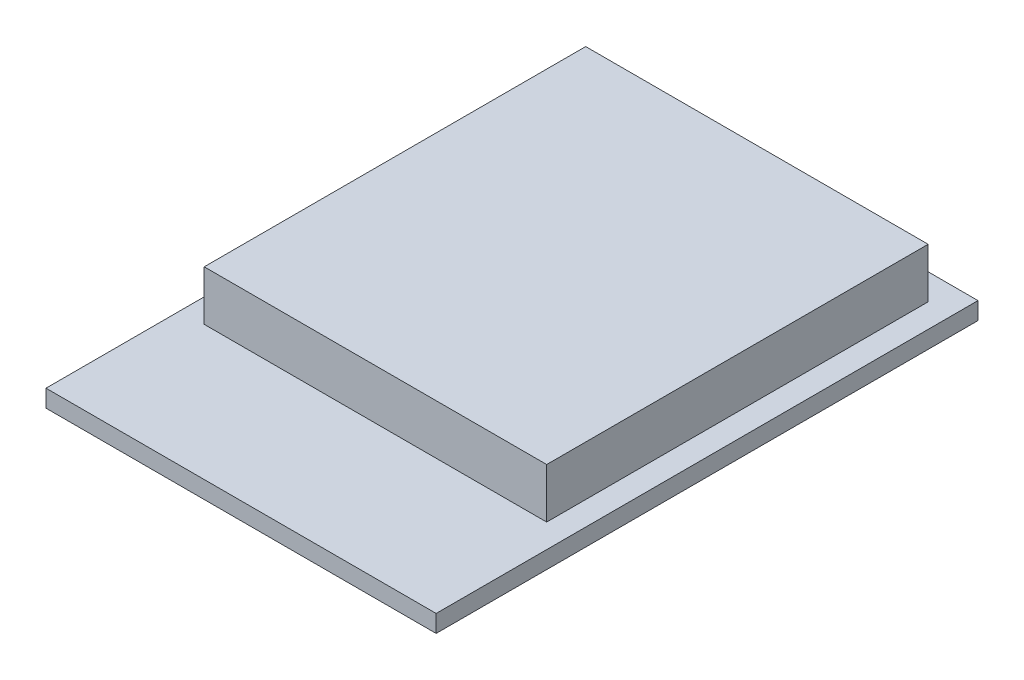
ISO-10303-21;
HEADER;
FILE_DESCRIPTION(('STEP AP214'),'2;1');
FILE_NAME('part.step','',(''),(''),'','','');
FILE_SCHEMA(('AUTOMOTIVE_DESIGN { 1 0 10303 214 1 1 1 1 }'));
ENDSEC;
DATA;
#1=APPLICATION_CONTEXT('core data for automotive mechanical design processes');
#2=APPLICATION_PROTOCOL_DEFINITION('international standard','automotive_design',2000,#1);
#3=PRODUCT_CONTEXT('',#1,'mechanical');
#4=PRODUCT('Part','Part','',(#3));
#5=PRODUCT_RELATED_PRODUCT_CATEGORY('part','',(#4));
#6=PRODUCT_DEFINITION_FORMATION('','',#4);
#7=PRODUCT_DEFINITION_CONTEXT('part definition',#1,'design');
#8=PRODUCT_DEFINITION('design','',#6,#7);
#9=PRODUCT_DEFINITION_SHAPE('','',#8);
#10=(LENGTH_UNIT() NAMED_UNIT(*) SI_UNIT(.MILLI.,.METRE.));
#11=(NAMED_UNIT(*) PLANE_ANGLE_UNIT() SI_UNIT($,.RADIAN.));
#12=(NAMED_UNIT(*) SI_UNIT($,.STERADIAN.) SOLID_ANGLE_UNIT());
#13=UNCERTAINTY_MEASURE_WITH_UNIT(LENGTH_MEASURE(1.E-05),#10,'distance_accuracy_value','');
#14=(GEOMETRIC_REPRESENTATION_CONTEXT(3) GLOBAL_UNCERTAINTY_ASSIGNED_CONTEXT((#13)) GLOBAL_UNIT_ASSIGNED_CONTEXT((#10,
#11,#12)) REPRESENTATION_CONTEXT('',''));
#15=CARTESIAN_POINT('',(0.,0.,0.));
#16=DIRECTION('',(0.,0.,1.));
#17=DIRECTION('',(1.,0.,0.));
#18=AXIS2_PLACEMENT_3D('',#15,#16,#17);
#19=CARTESIAN_POINT('',(-9.,0.8,12.5));
#20=DIRECTION('',(0.,1.,0.));
#21=DIRECTION('',(0.,0.,1.));
#22=AXIS2_PLACEMENT_3D('',#19,#20,#21);
#23=PLANE('',#22);
#24=DIRECTION('',(0.,0.,1.));
#25=VECTOR('',#24,1.);
#26=CARTESIAN_POINT('',(-9.,0.8,-12.5));
#27=LINE('',#26,#25);
#28=CARTESIAN_POINT('',(-9.,0.8,-12.5));
#29=VERTEX_POINT('',#28);
#30=CARTESIAN_POINT('',(-9.,0.8,12.5));
#31=VERTEX_POINT('',#30);
#32=EDGE_CURVE('E481',#29,#31,#27,.T.);
#33=ORIENTED_EDGE('',*,*,#32,.T.);
#34=DIRECTION('',(1.,0.,0.));
#35=VECTOR('',#34,1.);
#36=CARTESIAN_POINT('',(-9.,0.8,12.5));
#37=LINE('',#36,#35);
#38=CARTESIAN_POINT('',(9.,0.8,12.5));
#39=VERTEX_POINT('',#38);
#40=EDGE_CURVE('E483',#31,#39,#37,.T.);
#41=ORIENTED_EDGE('',*,*,#40,.T.);
#42=DIRECTION('',(0.,0.,-1.));
#43=VECTOR('',#42,1.);
#44=CARTESIAN_POINT('',(9.,0.8,-12.5));
#45=LINE('',#44,#43);
#46=CARTESIAN_POINT('',(9.,0.8,-12.5));
#47=VERTEX_POINT('',#46);
#48=EDGE_CURVE('E485',#39,#47,#45,.T.);
#49=ORIENTED_EDGE('',*,*,#48,.T.);
#50=DIRECTION('',(-1.,0.,0.));
#51=VECTOR('',#50,1.);
#52=CARTESIAN_POINT('',(-9.,0.8,-12.5));
#53=LINE('',#52,#51);
#54=EDGE_CURVE('E390',#47,#29,#53,.T.);
#55=ORIENTED_EDGE('',*,*,#54,.T.);
#56=EDGE_LOOP('',(#33,#41,#49,#55));
#57=FACE_BOUND('',#56,.T.);
#58=DIRECTION('',(-1.,0.,0.));
#59=VECTOR('',#58,1.);
#60=CARTESIAN_POINT('',(7.9,0.8,-11.3));
#61=LINE('',#60,#59);
#62=CARTESIAN_POINT('',(7.9,0.8,-11.3));
#63=VERTEX_POINT('',#62);
#64=CARTESIAN_POINT('',(-7.9,0.8,-11.3));
#65=VERTEX_POINT('',#64);
#66=EDGE_CURVE('E438',#63,#65,#61,.T.);
#67=ORIENTED_EDGE('',*,*,#66,.F.);
#68=DIRECTION('',(0.,0.,-1.));
#69=VECTOR('',#68,1.);
#70=CARTESIAN_POINT('',(7.9,0.8,6.3));
#71=LINE('',#70,#69);
#72=CARTESIAN_POINT('',(7.9,0.8,6.3));
#73=VERTEX_POINT('',#72);
#74=EDGE_CURVE('E449',#73,#63,#71,.T.);
#75=ORIENTED_EDGE('',*,*,#74,.F.);
#76=DIRECTION('',(1.,0.,0.));
#77=VECTOR('',#76,1.);
#78=CARTESIAN_POINT('',(7.9,0.8,6.3));
#79=LINE('',#78,#77);
#80=CARTESIAN_POINT('',(-7.9,0.8,6.3));
#81=VERTEX_POINT('',#80);
#82=EDGE_CURVE('E459',#81,#73,#79,.T.);
#83=ORIENTED_EDGE('',*,*,#82,.F.);
#84=DIRECTION('',(0.,0.,1.));
#85=VECTOR('',#84,1.);
#86=CARTESIAN_POINT('',(-7.9,0.8,6.3));
#87=LINE('',#86,#85);
#88=EDGE_CURVE('E457',#65,#81,#87,.T.);
#89=ORIENTED_EDGE('',*,*,#88,.F.);
#90=EDGE_LOOP('',(#67,#75,#83,#89));
#91=FACE_BOUND('',#90,.T.);
#92=ADVANCED_FACE('F367',(#57,#91),#23,.T.);
#93=CARTESIAN_POINT('',(-9.,0.8,-12.5));
#94=DIRECTION('',(1.,0.,0.));
#95=DIRECTION('',(0.,0.,-1.));
#96=AXIS2_PLACEMENT_3D('',#93,#94,#95);
#97=PLANE('',#96);
#98=DIRECTION('',(0.,0.,1.));
#99=VECTOR('',#98,1.);
#100=CARTESIAN_POINT('',(-9.,0.,-12.5));
#101=LINE('',#100,#99);
#102=CARTESIAN_POINT('',(-9.,0.,-12.5));
#103=VERTEX_POINT('',#102);
#104=CARTESIAN_POINT('',(-9.,0.,12.5));
#105=VERTEX_POINT('',#104);
#106=EDGE_CURVE('E444',#103,#105,#101,.T.);
#107=ORIENTED_EDGE('',*,*,#106,.T.);
#108=DIRECTION('',(0.,-1.,0.));
#109=VECTOR('',#108,1.);
#110=CARTESIAN_POINT('',(-9.,0.8,12.5));
#111=LINE('',#110,#109);
#112=EDGE_CURVE('E11',#31,#105,#111,.T.);
#113=ORIENTED_EDGE('',*,*,#112,.F.);
#114=ORIENTED_EDGE('',*,*,#32,.F.);
#115=DIRECTION('',(0.,-1.,0.));
#116=VECTOR('',#115,1.);
#117=CARTESIAN_POINT('',(-9.,0.8,-12.5));
#118=LINE('',#117,#116);
#119=EDGE_CURVE('E488',#29,#103,#118,.T.);
#120=ORIENTED_EDGE('',*,*,#119,.T.);
#121=EDGE_LOOP('',(#107,#113,#114,#120));
#122=FACE_BOUND('',#121,.T.);
#123=ADVANCED_FACE('F369',(#122),#97,.F.);
#124=CARTESIAN_POINT('',(-9.,0.8,12.5));
#125=DIRECTION('',(0.,0.,-1.));
#126=DIRECTION('',(-1.,0.,0.));
#127=AXIS2_PLACEMENT_3D('',#124,#125,#126);
#128=PLANE('',#127);
#129=DIRECTION('',(1.,0.,0.));
#130=VECTOR('',#129,1.);
#131=CARTESIAN_POINT('',(-9.,0.,12.5));
#132=LINE('',#131,#130);
#133=CARTESIAN_POINT('',(9.,0.,12.5));
#134=VERTEX_POINT('',#133);
#135=EDGE_CURVE('E475',#105,#134,#132,.T.);
#136=ORIENTED_EDGE('',*,*,#135,.T.);
#137=DIRECTION('',(0.,-1.,0.));
#138=VECTOR('',#137,1.);
#139=CARTESIAN_POINT('',(9.,0.8,12.5));
#140=LINE('',#139,#138);
#141=EDGE_CURVE('E375',#39,#134,#140,.T.);
#142=ORIENTED_EDGE('',*,*,#141,.F.);
#143=ORIENTED_EDGE('',*,*,#40,.F.);
#144=ORIENTED_EDGE('',*,*,#112,.T.);
#145=EDGE_LOOP('',(#136,#142,#143,#144));
#146=FACE_BOUND('',#145,.T.);
#147=ADVANCED_FACE('F510',(#146),#128,.F.);
#148=CARTESIAN_POINT('',(9.,0.8,-12.5));
#149=DIRECTION('',(-1.,0.,0.));
#150=DIRECTION('',(0.,0.,1.));
#151=AXIS2_PLACEMENT_3D('',#148,#149,#150);
#152=PLANE('',#151);
#153=DIRECTION('',(0.,0.,-1.));
#154=VECTOR('',#153,1.);
#155=CARTESIAN_POINT('',(9.,0.,-12.5));
#156=LINE('',#155,#154);
#157=CARTESIAN_POINT('',(9.,0.,-12.5));
#158=VERTEX_POINT('',#157);
#159=EDGE_CURVE('E477',#134,#158,#156,.T.);
#160=ORIENTED_EDGE('',*,*,#159,.T.);
#161=DIRECTION('',(0.,-1.,0.));
#162=VECTOR('',#161,1.);
#163=CARTESIAN_POINT('',(9.,0.8,-12.5));
#164=LINE('',#163,#162);
#165=EDGE_CURVE('E491',#47,#158,#164,.T.);
#166=ORIENTED_EDGE('',*,*,#165,.F.);
#167=ORIENTED_EDGE('',*,*,#48,.F.);
#168=ORIENTED_EDGE('',*,*,#141,.T.);
#169=EDGE_LOOP('',(#160,#166,#167,#168));
#170=FACE_BOUND('',#169,.T.);
#171=ADVANCED_FACE('F498',(#170),#152,.F.);
#172=CARTESIAN_POINT('',(-9.,0.8,-12.5));
#173=DIRECTION('',(0.,0.,1.));
#174=DIRECTION('',(1.,0.,0.));
#175=AXIS2_PLACEMENT_3D('',#172,#173,#174);
#176=PLANE('',#175);
#177=DIRECTION('',(-1.,0.,0.));
#178=VECTOR('',#177,1.);
#179=CARTESIAN_POINT('',(-9.,0.,-12.5));
#180=LINE('',#179,#178);
#181=EDGE_CURVE('E479',#158,#103,#180,.T.);
#182=ORIENTED_EDGE('',*,*,#181,.T.);
#183=ORIENTED_EDGE('',*,*,#119,.F.);
#184=ORIENTED_EDGE('',*,*,#54,.F.);
#185=ORIENTED_EDGE('',*,*,#165,.T.);
#186=EDGE_LOOP('',(#182,#183,#184,#185));
#187=FACE_BOUND('',#186,.T.);
#188=ADVANCED_FACE('F506',(#187),#176,.F.);
#189=CARTESIAN_POINT('',(-9.,0.,12.5));
#190=DIRECTION('',(0.,1.,0.));
#191=DIRECTION('',(0.,0.,1.));
#192=AXIS2_PLACEMENT_3D('',#189,#190,#191);
#193=PLANE('',#192);
#194=ORIENTED_EDGE('',*,*,#106,.F.);
#195=ORIENTED_EDGE('',*,*,#181,.F.);
#196=ORIENTED_EDGE('',*,*,#159,.F.);
#197=ORIENTED_EDGE('',*,*,#135,.F.);
#198=EDGE_LOOP('',(#194,#195,#196,#197));
#199=FACE_BOUND('',#198,.T.);
#200=ADVANCED_FACE('F504',(#199),#193,.F.);
#201=CARTESIAN_POINT('',(7.9,3.1,6.3));
#202=DIRECTION('',(-1.,0.,0.));
#203=DIRECTION('',(0.,0.,1.));
#204=AXIS2_PLACEMENT_3D('',#201,#202,#203);
#205=PLANE('',#204);
#206=ORIENTED_EDGE('',*,*,#74,.T.);
#207=DIRECTION('',(0.,-1.,0.));
#208=VECTOR('',#207,1.);
#209=CARTESIAN_POINT('',(7.9,3.1,-11.3));
#210=LINE('',#209,#208);
#211=CARTESIAN_POINT('',(7.9,3.1,-11.3));
#212=VERTEX_POINT('',#211);
#213=EDGE_CURVE('E433',#212,#63,#210,.T.);
#214=ORIENTED_EDGE('',*,*,#213,.F.);
#215=DIRECTION('',(0.,0.,-1.));
#216=VECTOR('',#215,1.);
#217=CARTESIAN_POINT('',(7.9,3.1,6.3));
#218=LINE('',#217,#216);
#219=CARTESIAN_POINT('',(7.9,3.1,6.3));
#220=VERTEX_POINT('',#219);
#221=EDGE_CURVE('E463',#220,#212,#218,.T.);
#222=ORIENTED_EDGE('',*,*,#221,.F.);
#223=DIRECTION('',(0.,-1.,0.));
#224=VECTOR('',#223,1.);
#225=CARTESIAN_POINT('',(7.9,3.1,6.3));
#226=LINE('',#225,#224);
#227=EDGE_CURVE('E452',#220,#73,#226,.T.);
#228=ORIENTED_EDGE('',*,*,#227,.T.);
#229=EDGE_LOOP('',(#206,#214,#222,#228));
#230=FACE_BOUND('',#229,.T.);
#231=ADVANCED_FACE('F450',(#230),#205,.F.);
#232=CARTESIAN_POINT('',(7.9,3.1,-11.3));
#233=DIRECTION('',(0.,0.,1.));
#234=DIRECTION('',(1.,0.,0.));
#235=AXIS2_PLACEMENT_3D('',#232,#233,#234);
#236=PLANE('',#235);
#237=ORIENTED_EDGE('',*,*,#66,.T.);
#238=DIRECTION('',(0.,-1.,0.));
#239=VECTOR('',#238,1.);
#240=CARTESIAN_POINT('',(-7.9,3.1,-11.3));
#241=LINE('',#240,#239);
#242=CARTESIAN_POINT('',(-7.9,3.1,-11.3));
#243=VERTEX_POINT('',#242);
#244=EDGE_CURVE('E445',#243,#65,#241,.T.);
#245=ORIENTED_EDGE('',*,*,#244,.F.);
#246=DIRECTION('',(-1.,0.,0.));
#247=VECTOR('',#246,1.);
#248=CARTESIAN_POINT('',(7.9,3.1,-11.3));
#249=LINE('',#248,#247);
#250=EDGE_CURVE('E440',#212,#243,#249,.T.);
#251=ORIENTED_EDGE('',*,*,#250,.F.);
#252=ORIENTED_EDGE('',*,*,#213,.T.);
#253=EDGE_LOOP('',(#237,#245,#251,#252));
#254=FACE_BOUND('',#253,.T.);
#255=ADVANCED_FACE('F435',(#254),#236,.F.);
#256=CARTESIAN_POINT('',(-7.9,3.1,6.3));
#257=DIRECTION('',(1.,0.,0.));
#258=DIRECTION('',(0.,0.,-1.));
#259=AXIS2_PLACEMENT_3D('',#256,#257,#258);
#260=PLANE('',#259);
#261=ORIENTED_EDGE('',*,*,#88,.T.);
#262=DIRECTION('',(0.,-1.,0.));
#263=VECTOR('',#262,1.);
#264=CARTESIAN_POINT('',(-7.9,3.1,6.3));
#265=LINE('',#264,#263);
#266=CARTESIAN_POINT('',(-7.9,3.1,6.3));
#267=VERTEX_POINT('',#266);
#268=EDGE_CURVE('E382',#267,#81,#265,.T.);
#269=ORIENTED_EDGE('',*,*,#268,.F.);
#270=DIRECTION('',(0.,0.,1.));
#271=VECTOR('',#270,1.);
#272=CARTESIAN_POINT('',(-7.9,3.1,6.3));
#273=LINE('',#272,#271);
#274=EDGE_CURVE('E466',#243,#267,#273,.T.);
#275=ORIENTED_EDGE('',*,*,#274,.F.);
#276=ORIENTED_EDGE('',*,*,#244,.T.);
#277=EDGE_LOOP('',(#261,#269,#275,#276));
#278=FACE_BOUND('',#277,.T.);
#279=ADVANCED_FACE('F534',(#278),#260,.F.);
#280=CARTESIAN_POINT('',(7.9,3.1,6.3));
#281=DIRECTION('',(0.,0.,-1.));
#282=DIRECTION('',(-1.,0.,0.));
#283=AXIS2_PLACEMENT_3D('',#280,#281,#282);
#284=PLANE('',#283);
#285=ORIENTED_EDGE('',*,*,#82,.T.);
#286=ORIENTED_EDGE('',*,*,#227,.F.);
#287=DIRECTION('',(1.,0.,0.));
#288=VECTOR('',#287,1.);
#289=CARTESIAN_POINT('',(7.9,3.1,6.3));
#290=LINE('',#289,#288);
#291=EDGE_CURVE('E468',#267,#220,#290,.T.);
#292=ORIENTED_EDGE('',*,*,#291,.F.);
#293=ORIENTED_EDGE('',*,*,#268,.T.);
#294=EDGE_LOOP('',(#285,#286,#292,#293));
#295=FACE_BOUND('',#294,.T.);
#296=ADVANCED_FACE('F539',(#295),#284,.F.);
#297=CARTESIAN_POINT('',(7.9,3.1,-11.3));
#298=DIRECTION('',(0.,1.,0.));
#299=DIRECTION('',(0.,0.,1.));
#300=AXIS2_PLACEMENT_3D('',#297,#298,#299);
#301=PLANE('',#300);
#302=ORIENTED_EDGE('',*,*,#221,.T.);
#303=ORIENTED_EDGE('',*,*,#250,.T.);
#304=ORIENTED_EDGE('',*,*,#274,.T.);
#305=ORIENTED_EDGE('',*,*,#291,.T.);
#306=EDGE_LOOP('',(#302,#303,#304,#305));
#307=FACE_BOUND('',#306,.T.);
#308=ADVANCED_FACE('F543',(#307),#301,.T.);
#309=CLOSED_SHELL('',(#92,#123,#147,#171,#188,#200,#231,#255,#279,#296,#308));
#310=MANIFOLD_SOLID_BREP('B2',#309);
#311=ADVANCED_BREP_SHAPE_REPRESENTATION('',(#18,#310),#14);
#312=SHAPE_DEFINITION_REPRESENTATION(#9,#311);
ENDSEC;
END-ISO-10303-21;
